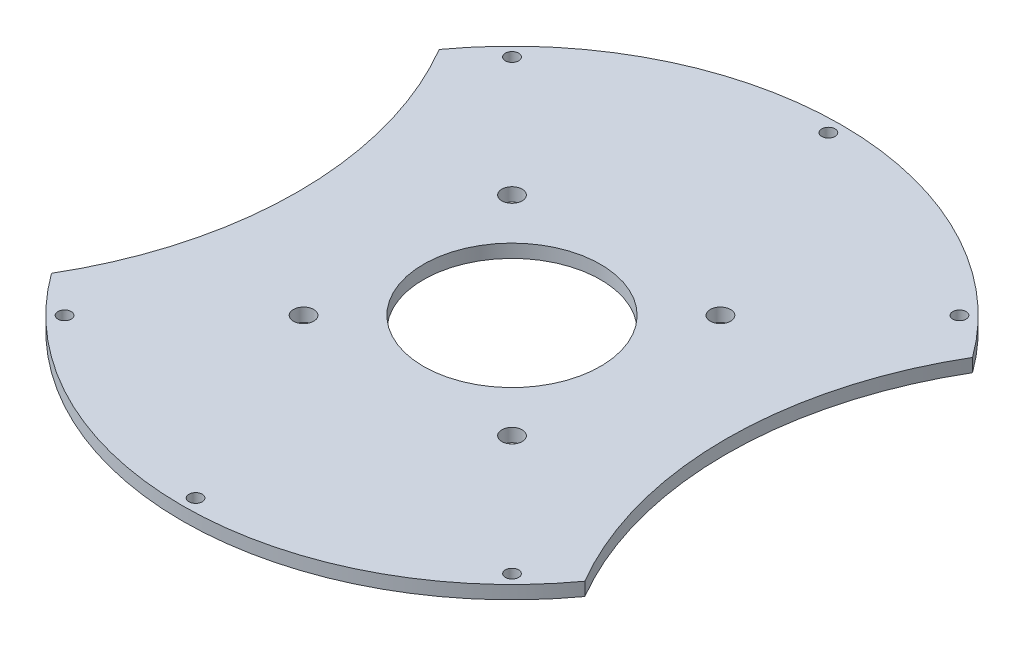
ISO-10303-21;
HEADER;
FILE_DESCRIPTION(('STEP AP214'),'2;1');
FILE_NAME('part.step','',(''),(''),'','','');
FILE_SCHEMA(('AUTOMOTIVE_DESIGN { 1 0 10303 214 1 1 1 1 }'));
ENDSEC;
DATA;
#1=APPLICATION_CONTEXT('core data for automotive mechanical design processes');
#2=APPLICATION_PROTOCOL_DEFINITION('international standard','automotive_design',2000,#1);
#3=PRODUCT_CONTEXT('',#1,'mechanical');
#4=PRODUCT('Part','Part','',(#3));
#5=PRODUCT_RELATED_PRODUCT_CATEGORY('part','',(#4));
#6=PRODUCT_DEFINITION_FORMATION('','',#4);
#7=PRODUCT_DEFINITION_CONTEXT('part definition',#1,'design');
#8=PRODUCT_DEFINITION('design','',#6,#7);
#9=PRODUCT_DEFINITION_SHAPE('','',#8);
#10=(LENGTH_UNIT() NAMED_UNIT(*) SI_UNIT(.MILLI.,.METRE.));
#11=(NAMED_UNIT(*) PLANE_ANGLE_UNIT() SI_UNIT($,.RADIAN.));
#12=(NAMED_UNIT(*) SI_UNIT($,.STERADIAN.) SOLID_ANGLE_UNIT());
#13=UNCERTAINTY_MEASURE_WITH_UNIT(LENGTH_MEASURE(1.E-05),#10,'distance_accuracy_value','');
#14=(GEOMETRIC_REPRESENTATION_CONTEXT(3) GLOBAL_UNCERTAINTY_ASSIGNED_CONTEXT((#13)) GLOBAL_UNIT_ASSIGNED_CONTEXT((#10,
#11,#12)) REPRESENTATION_CONTEXT('',''));
#15=CARTESIAN_POINT('',(0.,0.,0.));
#16=DIRECTION('',(0.,0.,1.));
#17=DIRECTION('',(1.,0.,0.));
#18=AXIS2_PLACEMENT_3D('',#15,#16,#17);
#19=CARTESIAN_POINT('',(-134.940513471356,3.,1.70863972835192E-12));
#20=DIRECTION('',(0.,-1.,0.));
#21=DIRECTION('',(0.,0.,-1.));
#22=AXIS2_PLACEMENT_3D('',#19,#20,#21);
#23=CYLINDRICAL_SURFACE('',#22,86.5797866531598);
#24=CARTESIAN_POINT('',(-134.940513471356,0.,1.70863972835192E-12));
#25=DIRECTION('',(0.,1.,0.));
#26=DIRECTION('',(0.,0.,1.));
#27=AXIS2_PLACEMENT_3D('',#24,#25,#26);
#28=CIRCLE('',#27,86.5797866531598);
#29=CARTESIAN_POINT('',(-60.2603780756276,0.,43.8056712559278));
#30=VERTEX_POINT('',#29);
#31=CARTESIAN_POINT('',(-60.2603780756287,0.,-43.8056712559263));
#32=VERTEX_POINT('',#31);
#33=EDGE_CURVE('E131',#30,#32,#28,.T.);
#34=ORIENTED_EDGE('',*,*,#33,.F.);
#35=DIRECTION('',(0.,-1.,0.));
#36=VECTOR('',#35,1.);
#37=CARTESIAN_POINT('',(-60.2603780756276,3.,43.8056712559278));
#38=LINE('',#37,#36);
#39=CARTESIAN_POINT('',(-60.2603780756276,3.,43.8056712559278));
#40=VERTEX_POINT('',#39);
#41=EDGE_CURVE('E11',#40,#30,#38,.T.);
#42=ORIENTED_EDGE('',*,*,#41,.F.);
#43=CARTESIAN_POINT('',(-134.940513471356,3.,1.70863972835192E-12));
#44=DIRECTION('',(0.,1.,0.));
#45=DIRECTION('',(0.,0.,1.));
#46=AXIS2_PLACEMENT_3D('',#43,#44,#45);
#47=CIRCLE('',#46,86.5797866531598);
#48=CARTESIAN_POINT('',(-60.2603780756287,3.,-43.8056712559263));
#49=VERTEX_POINT('',#48);
#50=EDGE_CURVE('E105',#40,#49,#47,.T.);
#51=ORIENTED_EDGE('',*,*,#50,.T.);
#52=DIRECTION('',(0.,-1.,0.));
#53=VECTOR('',#52,1.);
#54=CARTESIAN_POINT('',(-60.2603780756287,3.,-43.8056712559263));
#55=LINE('',#54,#53);
#56=EDGE_CURVE('E85',#49,#32,#55,.T.);
#57=ORIENTED_EDGE('',*,*,#56,.T.);
#58=EDGE_LOOP('',(#34,#42,#51,#57));
#59=FACE_BOUND('',#58,.T.);
#60=ADVANCED_FACE('F45',(#59),#23,.F.);
#61=CARTESIAN_POINT('',(0.,3.,0.));
#62=DIRECTION('',(0.,-1.,0.));
#63=DIRECTION('',(0.,0.,-1.));
#64=AXIS2_PLACEMENT_3D('',#61,#62,#63);
#65=CYLINDRICAL_SURFACE('',#64,74.5);
#66=CARTESIAN_POINT('',(0.,0.,0.));
#67=DIRECTION('',(0.,1.,0.));
#68=DIRECTION('',(0.,0.,1.));
#69=AXIS2_PLACEMENT_3D('',#66,#67,#68);
#70=CIRCLE('',#69,74.5);
#71=CARTESIAN_POINT('',(60.2603780756276,0.,43.8056712559278));
#72=VERTEX_POINT('',#71);
#73=EDGE_CURVE('E111',#30,#72,#70,.T.);
#74=ORIENTED_EDGE('',*,*,#73,.T.);
#75=DIRECTION('',(0.,-1.,0.));
#76=VECTOR('',#75,1.);
#77=CARTESIAN_POINT('',(60.2603780756276,3.,43.8056712559278));
#78=LINE('',#77,#76);
#79=CARTESIAN_POINT('',(60.2603780756276,3.,43.8056712559278));
#80=VERTEX_POINT('',#79);
#81=EDGE_CURVE('E55',#80,#72,#78,.T.);
#82=ORIENTED_EDGE('',*,*,#81,.F.);
#83=CARTESIAN_POINT('',(0.,3.,0.));
#84=DIRECTION('',(0.,1.,0.));
#85=DIRECTION('',(0.,0.,1.));
#86=AXIS2_PLACEMENT_3D('',#83,#84,#85);
#87=CIRCLE('',#86,74.5);
#88=EDGE_CURVE('E101',#40,#80,#87,.T.);
#89=ORIENTED_EDGE('',*,*,#88,.F.);
#90=ORIENTED_EDGE('',*,*,#41,.T.);
#91=EDGE_LOOP('',(#74,#82,#89,#90));
#92=FACE_BOUND('',#91,.T.);
#93=ADVANCED_FACE('F109',(#92),#65,.T.);
#94=CARTESIAN_POINT('',(134.940513471356,3.,1.70863972835192E-12));
#95=DIRECTION('',(0.,-1.,0.));
#96=DIRECTION('',(0.,0.,-1.));
#97=AXIS2_PLACEMENT_3D('',#94,#95,#96);
#98=CYLINDRICAL_SURFACE('',#97,86.5797866531598);
#99=CARTESIAN_POINT('',(134.940513471356,0.,1.70863972835192E-12));
#100=DIRECTION('',(0.,1.,0.));
#101=DIRECTION('',(0.,0.,1.));
#102=AXIS2_PLACEMENT_3D('',#99,#100,#101);
#103=CIRCLE('',#102,86.5797866531598);
#104=CARTESIAN_POINT('',(60.2603780756287,0.,-43.8056712559263));
#105=VERTEX_POINT('',#104);
#106=EDGE_CURVE('E126',#72,#105,#103,.F.);
#107=ORIENTED_EDGE('',*,*,#106,.T.);
#108=DIRECTION('',(0.,-1.,0.));
#109=VECTOR('',#108,1.);
#110=CARTESIAN_POINT('',(60.2603780756287,3.,-43.8056712559263));
#111=LINE('',#110,#109);
#112=CARTESIAN_POINT('',(60.2603780756287,3.,-43.8056712559263));
#113=VERTEX_POINT('',#112);
#114=EDGE_CURVE('E99',#113,#105,#111,.T.);
#115=ORIENTED_EDGE('',*,*,#114,.F.);
#116=CARTESIAN_POINT('',(134.940513471356,3.,1.70863972835192E-12));
#117=DIRECTION('',(0.,1.,0.));
#118=DIRECTION('',(0.,0.,1.));
#119=AXIS2_PLACEMENT_3D('',#116,#117,#118);
#120=CIRCLE('',#119,86.5797866531598);
#121=EDGE_CURVE('E93',#80,#113,#120,.F.);
#122=ORIENTED_EDGE('',*,*,#121,.F.);
#123=ORIENTED_EDGE('',*,*,#81,.T.);
#124=EDGE_LOOP('',(#107,#115,#122,#123));
#125=FACE_BOUND('',#124,.T.);
#126=ADVANCED_FACE('F96',(#125),#98,.F.);
#127=CARTESIAN_POINT('',(0.,3.,0.));
#128=DIRECTION('',(0.,-1.,0.));
#129=DIRECTION('',(0.,0.,-1.));
#130=AXIS2_PLACEMENT_3D('',#127,#128,#129);
#131=CYLINDRICAL_SURFACE('',#130,74.5);
#132=CARTESIAN_POINT('',(0.,0.,0.));
#133=DIRECTION('',(0.,1.,0.));
#134=DIRECTION('',(0.,0.,1.));
#135=AXIS2_PLACEMENT_3D('',#132,#133,#134);
#136=CIRCLE('',#135,74.5);
#137=EDGE_CURVE('E78',#105,#32,#136,.T.);
#138=ORIENTED_EDGE('',*,*,#137,.T.);
#139=ORIENTED_EDGE('',*,*,#56,.F.);
#140=CARTESIAN_POINT('',(0.,3.,0.));
#141=DIRECTION('',(0.,1.,0.));
#142=DIRECTION('',(0.,0.,1.));
#143=AXIS2_PLACEMENT_3D('',#140,#141,#142);
#144=CIRCLE('',#143,74.5);
#145=EDGE_CURVE('E63',#113,#49,#144,.T.);
#146=ORIENTED_EDGE('',*,*,#145,.F.);
#147=ORIENTED_EDGE('',*,*,#114,.T.);
#148=EDGE_LOOP('',(#138,#139,#146,#147));
#149=FACE_BOUND('',#148,.T.);
#150=ADVANCED_FACE('F250',(#149),#131,.T.);
#151=CARTESIAN_POINT('',(-50.5581348548377,3.,-50.5581348548369));
#152=DIRECTION('',(0.,-1.,0.));
#153=DIRECTION('',(0.,0.,-1.));
#154=AXIS2_PLACEMENT_3D('',#151,#152,#153);
#155=CYLINDRICAL_SURFACE('',#154,1.5);
#156=CARTESIAN_POINT('',(-50.5581348548377,3.,-50.5581348548369));
#157=DIRECTION('',(0.,1.,0.));
#158=DIRECTION('',(0.,0.,1.));
#159=AXIS2_PLACEMENT_3D('',#156,#157,#158);
#160=CIRCLE('',#159,1.5);
#161=CARTESIAN_POINT('',(-50.5581348548377,3.,-49.0581348548369));
#162=VERTEX_POINT('',#161);
#163=EDGE_CURVE('E181',#162,#162,#160,.T.);
#164=ORIENTED_EDGE('',*,*,#163,.T.);
#165=EDGE_LOOP('',(#164));
#166=FACE_BOUND('',#165,.T.);
#167=CARTESIAN_POINT('',(-50.5581348548377,0.,-50.5581348548369));
#168=DIRECTION('',(0.,1.,0.));
#169=DIRECTION('',(0.,0.,1.));
#170=AXIS2_PLACEMENT_3D('',#167,#168,#169);
#171=CIRCLE('',#170,1.5);
#172=CARTESIAN_POINT('',(-50.5581348548377,0.,-49.0581348548369));
#173=VERTEX_POINT('',#172);
#174=EDGE_CURVE('E134',#173,#173,#171,.T.);
#175=ORIENTED_EDGE('',*,*,#174,.F.);
#176=EDGE_LOOP('',(#175));
#177=FACE_BOUND('',#176,.T.);
#178=ADVANCED_FACE('F246',(#166,#177),#155,.F.);
#179=CARTESIAN_POINT('',(-50.5581348548353,3.,50.5581348548394));
#180=DIRECTION('',(0.,-1.,0.));
#181=DIRECTION('',(0.,0.,-1.));
#182=AXIS2_PLACEMENT_3D('',#179,#180,#181);
#183=CYLINDRICAL_SURFACE('',#182,1.5);
#184=CARTESIAN_POINT('',(-50.5581348548353,3.,50.5581348548394));
#185=DIRECTION('',(0.,1.,0.));
#186=DIRECTION('',(0.,0.,1.));
#187=AXIS2_PLACEMENT_3D('',#184,#185,#186);
#188=CIRCLE('',#187,1.5);
#189=CARTESIAN_POINT('',(-50.5581348548353,3.,52.0581348548394));
#190=VERTEX_POINT('',#189);
#191=EDGE_CURVE('E185',#190,#190,#188,.T.);
#192=ORIENTED_EDGE('',*,*,#191,.T.);
#193=EDGE_LOOP('',(#192));
#194=FACE_BOUND('',#193,.T.);
#195=CARTESIAN_POINT('',(-50.5581348548353,0.,50.5581348548394));
#196=DIRECTION('',(0.,1.,0.));
#197=DIRECTION('',(0.,0.,1.));
#198=AXIS2_PLACEMENT_3D('',#195,#196,#197);
#199=CIRCLE('',#198,1.5);
#200=CARTESIAN_POINT('',(-50.5581348548353,0.,52.0581348548394));
#201=VERTEX_POINT('',#200);
#202=EDGE_CURVE('E138',#201,#201,#199,.T.);
#203=ORIENTED_EDGE('',*,*,#202,.F.);
#204=EDGE_LOOP('',(#203));
#205=FACE_BOUND('',#204,.T.);
#206=ADVANCED_FACE('F249',(#194,#205),#183,.F.);
#207=CARTESIAN_POINT('',(3.39976700747603E-12,3.,71.5));
#208=DIRECTION('',(0.,-1.,0.));
#209=DIRECTION('',(0.,0.,-1.));
#210=AXIS2_PLACEMENT_3D('',#207,#208,#209);
#211=CYLINDRICAL_SURFACE('',#210,1.5);
#212=CARTESIAN_POINT('',(3.39976700747603E-12,3.,71.5));
#213=DIRECTION('',(0.,1.,0.));
#214=DIRECTION('',(0.,0.,1.));
#215=AXIS2_PLACEMENT_3D('',#212,#213,#214);
#216=CIRCLE('',#215,1.5);
#217=CARTESIAN_POINT('',(3.39976700747603E-12,3.,73.));
#218=VERTEX_POINT('',#217);
#219=EDGE_CURVE('E189',#218,#218,#216,.T.);
#220=ORIENTED_EDGE('',*,*,#219,.T.);
#221=EDGE_LOOP('',(#220));
#222=FACE_BOUND('',#221,.T.);
#223=CARTESIAN_POINT('',(3.39976700747603E-12,0.,71.5));
#224=DIRECTION('',(0.,1.,0.));
#225=DIRECTION('',(0.,0.,1.));
#226=AXIS2_PLACEMENT_3D('',#223,#224,#225);
#227=CIRCLE('',#226,1.5);
#228=CARTESIAN_POINT('',(3.39976700747603E-12,0.,73.));
#229=VERTEX_POINT('',#228);
#230=EDGE_CURVE('E142',#229,#229,#227,.T.);
#231=ORIENTED_EDGE('',*,*,#230,.F.);
#232=EDGE_LOOP('',(#231));
#233=FACE_BOUND('',#232,.T.);
#234=ADVANCED_FACE('F278',(#222,#233),#211,.F.);
#235=CARTESIAN_POINT('',(50.558134854841,3.,50.5581348548369));
#236=DIRECTION('',(0.,-1.,0.));
#237=DIRECTION('',(0.,0.,-1.));
#238=AXIS2_PLACEMENT_3D('',#235,#236,#237);
#239=CYLINDRICAL_SURFACE('',#238,1.5);
#240=CARTESIAN_POINT('',(50.558134854841,3.,50.5581348548369));
#241=DIRECTION('',(0.,1.,0.));
#242=DIRECTION('',(0.,0.,1.));
#243=AXIS2_PLACEMENT_3D('',#240,#241,#242);
#244=CIRCLE('',#243,1.5);
#245=CARTESIAN_POINT('',(50.558134854841,3.,52.0581348548369));
#246=VERTEX_POINT('',#245);
#247=EDGE_CURVE('E193',#246,#246,#244,.T.);
#248=ORIENTED_EDGE('',*,*,#247,.T.);
#249=EDGE_LOOP('',(#248));
#250=FACE_BOUND('',#249,.T.);
#251=CARTESIAN_POINT('',(50.558134854841,0.,50.5581348548369));
#252=DIRECTION('',(0.,1.,0.));
#253=DIRECTION('',(0.,0.,1.));
#254=AXIS2_PLACEMENT_3D('',#251,#252,#253);
#255=CIRCLE('',#254,1.5);
#256=CARTESIAN_POINT('',(50.558134854841,0.,52.0581348548369));
#257=VERTEX_POINT('',#256);
#258=EDGE_CURVE('E146',#257,#257,#255,.T.);
#259=ORIENTED_EDGE('',*,*,#258,.F.);
#260=EDGE_LOOP('',(#259));
#261=FACE_BOUND('',#260,.T.);
#262=ADVANCED_FACE('F282',(#250,#261),#239,.F.);
#263=CARTESIAN_POINT('',(50.5581348548386,3.,-50.5581348548393));
#264=DIRECTION('',(0.,-1.,0.));
#265=DIRECTION('',(0.,0.,-1.));
#266=AXIS2_PLACEMENT_3D('',#263,#264,#265);
#267=CYLINDRICAL_SURFACE('',#266,1.5);
#268=CARTESIAN_POINT('',(50.5581348548386,3.,-50.5581348548393));
#269=DIRECTION('',(0.,1.,0.));
#270=DIRECTION('',(0.,0.,1.));
#271=AXIS2_PLACEMENT_3D('',#268,#269,#270);
#272=CIRCLE('',#271,1.5);
#273=CARTESIAN_POINT('',(50.5581348548386,3.,-49.0581348548393));
#274=VERTEX_POINT('',#273);
#275=EDGE_CURVE('E197',#274,#274,#272,.T.);
#276=ORIENTED_EDGE('',*,*,#275,.T.);
#277=EDGE_LOOP('',(#276));
#278=FACE_BOUND('',#277,.T.);
#279=CARTESIAN_POINT('',(50.5581348548386,0.,-50.5581348548393));
#280=DIRECTION('',(0.,1.,0.));
#281=DIRECTION('',(0.,0.,1.));
#282=AXIS2_PLACEMENT_3D('',#279,#280,#281);
#283=CIRCLE('',#282,1.5);
#284=CARTESIAN_POINT('',(50.5581348548386,0.,-49.0581348548393));
#285=VERTEX_POINT('',#284);
#286=EDGE_CURVE('E150',#285,#285,#283,.T.);
#287=ORIENTED_EDGE('',*,*,#286,.F.);
#288=EDGE_LOOP('',(#287));
#289=FACE_BOUND('',#288,.T.);
#290=ADVANCED_FACE('F286',(#278,#289),#267,.F.);
#291=CARTESIAN_POINT('',(0.,3.,-71.5));
#292=DIRECTION('',(0.,-1.,0.));
#293=DIRECTION('',(0.,0.,-1.));
#294=AXIS2_PLACEMENT_3D('',#291,#292,#293);
#295=CYLINDRICAL_SURFACE('',#294,1.5);
#296=CARTESIAN_POINT('',(0.,3.,-71.5));
#297=DIRECTION('',(0.,1.,0.));
#298=DIRECTION('',(0.,0.,1.));
#299=AXIS2_PLACEMENT_3D('',#296,#297,#298);
#300=CIRCLE('',#299,1.5);
#301=CARTESIAN_POINT('',(0.,3.,-70.));
#302=VERTEX_POINT('',#301);
#303=EDGE_CURVE('E201',#302,#302,#300,.T.);
#304=ORIENTED_EDGE('',*,*,#303,.T.);
#305=EDGE_LOOP('',(#304));
#306=FACE_BOUND('',#305,.T.);
#307=CARTESIAN_POINT('',(0.,0.,-71.5));
#308=DIRECTION('',(0.,1.,0.));
#309=DIRECTION('',(0.,0.,1.));
#310=AXIS2_PLACEMENT_3D('',#307,#308,#309);
#311=CIRCLE('',#310,1.5);
#312=CARTESIAN_POINT('',(0.,0.,-70.));
#313=VERTEX_POINT('',#312);
#314=EDGE_CURVE('E154',#313,#313,#311,.T.);
#315=ORIENTED_EDGE('',*,*,#314,.F.);
#316=EDGE_LOOP('',(#315));
#317=FACE_BOUND('',#316,.T.);
#318=ADVANCED_FACE('F290',(#306,#317),#295,.F.);
#319=CARTESIAN_POINT('',(23.55,3.,23.55));
#320=DIRECTION('',(0.,-1.,0.));
#321=DIRECTION('',(0.,0.,-1.));
#322=AXIS2_PLACEMENT_3D('',#319,#320,#321);
#323=CYLINDRICAL_SURFACE('',#322,2.3);
#324=CARTESIAN_POINT('',(23.55,3.,23.55));
#325=DIRECTION('',(0.,1.,0.));
#326=DIRECTION('',(0.,0.,1.));
#327=AXIS2_PLACEMENT_3D('',#324,#325,#326);
#328=CIRCLE('',#327,2.3);
#329=CARTESIAN_POINT('',(23.55,3.,25.85));
#330=VERTEX_POINT('',#329);
#331=EDGE_CURVE('E205',#330,#330,#328,.T.);
#332=ORIENTED_EDGE('',*,*,#331,.T.);
#333=EDGE_LOOP('',(#332));
#334=FACE_BOUND('',#333,.T.);
#335=CARTESIAN_POINT('',(23.55,0.,23.55));
#336=DIRECTION('',(0.,1.,0.));
#337=DIRECTION('',(0.,0.,1.));
#338=AXIS2_PLACEMENT_3D('',#335,#336,#337);
#339=CIRCLE('',#338,2.3);
#340=CARTESIAN_POINT('',(23.55,0.,25.85));
#341=VERTEX_POINT('',#340);
#342=EDGE_CURVE('E158',#341,#341,#339,.T.);
#343=ORIENTED_EDGE('',*,*,#342,.F.);
#344=EDGE_LOOP('',(#343));
#345=FACE_BOUND('',#344,.T.);
#346=ADVANCED_FACE('F294',(#334,#345),#323,.F.);
#347=CARTESIAN_POINT('',(23.55,3.,-23.55));
#348=DIRECTION('',(0.,-1.,0.));
#349=DIRECTION('',(0.,0.,-1.));
#350=AXIS2_PLACEMENT_3D('',#347,#348,#349);
#351=CYLINDRICAL_SURFACE('',#350,2.3);
#352=CARTESIAN_POINT('',(23.55,3.,-23.55));
#353=DIRECTION('',(0.,1.,0.));
#354=DIRECTION('',(0.,0.,1.));
#355=AXIS2_PLACEMENT_3D('',#352,#353,#354);
#356=CIRCLE('',#355,2.3);
#357=CARTESIAN_POINT('',(23.55,3.,-21.25));
#358=VERTEX_POINT('',#357);
#359=EDGE_CURVE('E209',#358,#358,#356,.T.);
#360=ORIENTED_EDGE('',*,*,#359,.T.);
#361=EDGE_LOOP('',(#360));
#362=FACE_BOUND('',#361,.T.);
#363=CARTESIAN_POINT('',(23.55,0.,-23.55));
#364=DIRECTION('',(0.,1.,0.));
#365=DIRECTION('',(0.,0.,1.));
#366=AXIS2_PLACEMENT_3D('',#363,#364,#365);
#367=CIRCLE('',#366,2.3);
#368=CARTESIAN_POINT('',(23.55,0.,-21.25));
#369=VERTEX_POINT('',#368);
#370=EDGE_CURVE('E162',#369,#369,#367,.T.);
#371=ORIENTED_EDGE('',*,*,#370,.F.);
#372=EDGE_LOOP('',(#371));
#373=FACE_BOUND('',#372,.T.);
#374=ADVANCED_FACE('F298',(#362,#373),#351,.F.);
#375=CARTESIAN_POINT('',(-23.55,3.,23.55));
#376=DIRECTION('',(0.,-1.,0.));
#377=DIRECTION('',(0.,0.,-1.));
#378=AXIS2_PLACEMENT_3D('',#375,#376,#377);
#379=CYLINDRICAL_SURFACE('',#378,2.3);
#380=CARTESIAN_POINT('',(-23.55,3.,23.55));
#381=DIRECTION('',(0.,1.,0.));
#382=DIRECTION('',(0.,0.,1.));
#383=AXIS2_PLACEMENT_3D('',#380,#381,#382);
#384=CIRCLE('',#383,2.3);
#385=CARTESIAN_POINT('',(-23.55,3.,25.85));
#386=VERTEX_POINT('',#385);
#387=EDGE_CURVE('E213',#386,#386,#384,.T.);
#388=ORIENTED_EDGE('',*,*,#387,.T.);
#389=EDGE_LOOP('',(#388));
#390=FACE_BOUND('',#389,.T.);
#391=CARTESIAN_POINT('',(-23.55,0.,23.55));
#392=DIRECTION('',(0.,1.,0.));
#393=DIRECTION('',(0.,0.,1.));
#394=AXIS2_PLACEMENT_3D('',#391,#392,#393);
#395=CIRCLE('',#394,2.3);
#396=CARTESIAN_POINT('',(-23.55,0.,25.85));
#397=VERTEX_POINT('',#396);
#398=EDGE_CURVE('E166',#397,#397,#395,.T.);
#399=ORIENTED_EDGE('',*,*,#398,.F.);
#400=EDGE_LOOP('',(#399));
#401=FACE_BOUND('',#400,.T.);
#402=ADVANCED_FACE('F266',(#390,#401),#379,.F.);
#403=CARTESIAN_POINT('',(-23.55,3.,-23.55));
#404=DIRECTION('',(0.,-1.,0.));
#405=DIRECTION('',(0.,0.,-1.));
#406=AXIS2_PLACEMENT_3D('',#403,#404,#405);
#407=CYLINDRICAL_SURFACE('',#406,2.3);
#408=CARTESIAN_POINT('',(-23.55,3.,-23.55));
#409=DIRECTION('',(0.,1.,0.));
#410=DIRECTION('',(0.,0.,1.));
#411=AXIS2_PLACEMENT_3D('',#408,#409,#410);
#412=CIRCLE('',#411,2.3);
#413=CARTESIAN_POINT('',(-23.55,3.,-21.25));
#414=VERTEX_POINT('',#413);
#415=EDGE_CURVE('E123',#414,#414,#412,.T.);
#416=ORIENTED_EDGE('',*,*,#415,.T.);
#417=EDGE_LOOP('',(#416));
#418=FACE_BOUND('',#417,.T.);
#419=CARTESIAN_POINT('',(-23.55,0.,-23.55));
#420=DIRECTION('',(0.,1.,0.));
#421=DIRECTION('',(0.,0.,1.));
#422=AXIS2_PLACEMENT_3D('',#419,#420,#421);
#423=CIRCLE('',#422,2.3);
#424=CARTESIAN_POINT('',(-23.55,0.,-21.25));
#425=VERTEX_POINT('',#424);
#426=EDGE_CURVE('E170',#425,#425,#423,.T.);
#427=ORIENTED_EDGE('',*,*,#426,.F.);
#428=EDGE_LOOP('',(#427));
#429=FACE_BOUND('',#428,.T.);
#430=ADVANCED_FACE('F47',(#418,#429),#407,.F.);
#431=CARTESIAN_POINT('',(0.,3.,0.));
#432=DIRECTION('',(0.,-1.,0.));
#433=DIRECTION('',(0.,0.,-1.));
#434=AXIS2_PLACEMENT_3D('',#431,#432,#433);
#435=CYLINDRICAL_SURFACE('',#434,20.);
#436=CARTESIAN_POINT('',(0.,3.,0.));
#437=DIRECTION('',(0.,1.,0.));
#438=DIRECTION('',(0.,0.,1.));
#439=AXIS2_PLACEMENT_3D('',#436,#437,#438);
#440=CIRCLE('',#439,20.);
#441=CARTESIAN_POINT('',(0.,3.,20.));
#442=VERTEX_POINT('',#441);
#443=EDGE_CURVE('E118',#442,#442,#440,.T.);
#444=ORIENTED_EDGE('',*,*,#443,.T.);
#445=EDGE_LOOP('',(#444));
#446=FACE_BOUND('',#445,.T.);
#447=CARTESIAN_POINT('',(0.,0.,0.));
#448=DIRECTION('',(0.,1.,0.));
#449=DIRECTION('',(0.,0.,1.));
#450=AXIS2_PLACEMENT_3D('',#447,#448,#449);
#451=CIRCLE('',#450,20.);
#452=CARTESIAN_POINT('',(0.,0.,20.));
#453=VERTEX_POINT('',#452);
#454=EDGE_CURVE('E119',#453,#453,#451,.T.);
#455=ORIENTED_EDGE('',*,*,#454,.F.);
#456=EDGE_LOOP('',(#455));
#457=FACE_BOUND('',#456,.T.);
#458=ADVANCED_FACE('F226',(#446,#457),#435,.F.);
#459=CARTESIAN_POINT('',(0.,3.,0.));
#460=DIRECTION('',(0.,1.,0.));
#461=DIRECTION('',(0.,0.,1.));
#462=AXIS2_PLACEMENT_3D('',#459,#460,#461);
#463=PLANE('',#462);
#464=ORIENTED_EDGE('',*,*,#415,.F.);
#465=EDGE_LOOP('',(#464));
#466=FACE_BOUND('',#465,.T.);
#467=ORIENTED_EDGE('',*,*,#387,.F.);
#468=EDGE_LOOP('',(#467));
#469=FACE_BOUND('',#468,.T.);
#470=ORIENTED_EDGE('',*,*,#359,.F.);
#471=EDGE_LOOP('',(#470));
#472=FACE_BOUND('',#471,.T.);
#473=ORIENTED_EDGE('',*,*,#331,.F.);
#474=EDGE_LOOP('',(#473));
#475=FACE_BOUND('',#474,.T.);
#476=ORIENTED_EDGE('',*,*,#303,.F.);
#477=EDGE_LOOP('',(#476));
#478=FACE_BOUND('',#477,.T.);
#479=ORIENTED_EDGE('',*,*,#275,.F.);
#480=EDGE_LOOP('',(#479));
#481=FACE_BOUND('',#480,.T.);
#482=ORIENTED_EDGE('',*,*,#247,.F.);
#483=EDGE_LOOP('',(#482));
#484=FACE_BOUND('',#483,.T.);
#485=ORIENTED_EDGE('',*,*,#219,.F.);
#486=EDGE_LOOP('',(#485));
#487=FACE_BOUND('',#486,.T.);
#488=ORIENTED_EDGE('',*,*,#191,.F.);
#489=EDGE_LOOP('',(#488));
#490=FACE_BOUND('',#489,.T.);
#491=ORIENTED_EDGE('',*,*,#163,.F.);
#492=EDGE_LOOP('',(#491));
#493=FACE_BOUND('',#492,.T.);
#494=ORIENTED_EDGE('',*,*,#50,.F.);
#495=ORIENTED_EDGE('',*,*,#88,.T.);
#496=ORIENTED_EDGE('',*,*,#121,.T.);
#497=ORIENTED_EDGE('',*,*,#145,.T.);
#498=EDGE_LOOP('',(#494,#495,#496,#497));
#499=FACE_BOUND('',#498,.T.);
#500=ORIENTED_EDGE('',*,*,#443,.F.);
#501=EDGE_LOOP('',(#500));
#502=FACE_BOUND('',#501,.T.);
#503=ADVANCED_FACE('F103',(#466,#469,#472,#475,#478,#481,#484,#487,#490,#493,#499,#502),#463,.T.);
#504=CARTESIAN_POINT('',(0.,0.,0.));
#505=DIRECTION('',(0.,1.,0.));
#506=DIRECTION('',(0.,0.,1.));
#507=AXIS2_PLACEMENT_3D('',#504,#505,#506);
#508=PLANE('',#507);
#509=ORIENTED_EDGE('',*,*,#426,.T.);
#510=EDGE_LOOP('',(#509));
#511=FACE_BOUND('',#510,.T.);
#512=ORIENTED_EDGE('',*,*,#398,.T.);
#513=EDGE_LOOP('',(#512));
#514=FACE_BOUND('',#513,.T.);
#515=ORIENTED_EDGE('',*,*,#370,.T.);
#516=EDGE_LOOP('',(#515));
#517=FACE_BOUND('',#516,.T.);
#518=ORIENTED_EDGE('',*,*,#342,.T.);
#519=EDGE_LOOP('',(#518));
#520=FACE_BOUND('',#519,.T.);
#521=ORIENTED_EDGE('',*,*,#314,.T.);
#522=EDGE_LOOP('',(#521));
#523=FACE_BOUND('',#522,.T.);
#524=ORIENTED_EDGE('',*,*,#286,.T.);
#525=EDGE_LOOP('',(#524));
#526=FACE_BOUND('',#525,.T.);
#527=ORIENTED_EDGE('',*,*,#258,.T.);
#528=EDGE_LOOP('',(#527));
#529=FACE_BOUND('',#528,.T.);
#530=ORIENTED_EDGE('',*,*,#230,.T.);
#531=EDGE_LOOP('',(#530));
#532=FACE_BOUND('',#531,.T.);
#533=ORIENTED_EDGE('',*,*,#202,.T.);
#534=EDGE_LOOP('',(#533));
#535=FACE_BOUND('',#534,.T.);
#536=ORIENTED_EDGE('',*,*,#174,.T.);
#537=EDGE_LOOP('',(#536));
#538=FACE_BOUND('',#537,.T.);
#539=ORIENTED_EDGE('',*,*,#33,.T.);
#540=ORIENTED_EDGE('',*,*,#137,.F.);
#541=ORIENTED_EDGE('',*,*,#106,.F.);
#542=ORIENTED_EDGE('',*,*,#73,.F.);
#543=EDGE_LOOP('',(#539,#540,#541,#542));
#544=FACE_BOUND('',#543,.T.);
#545=ORIENTED_EDGE('',*,*,#454,.T.);
#546=EDGE_LOOP('',(#545));
#547=FACE_BOUND('',#546,.T.);
#548=ADVANCED_FACE('F225',(#511,#514,#517,#520,#523,#526,#529,#532,#535,#538,#544,#547),#508,.F.);
#549=CLOSED_SHELL('',(#60,#93,#126,#150,#178,#206,#234,#262,#290,#318,#346,#374,#402,#430,#458,
#503,#548));
#550=MANIFOLD_SOLID_BREP('B2',#549);
#551=ADVANCED_BREP_SHAPE_REPRESENTATION('',(#18,#550),#14);
#552=SHAPE_DEFINITION_REPRESENTATION(#9,#551);
ENDSEC;
END-ISO-10303-21;
